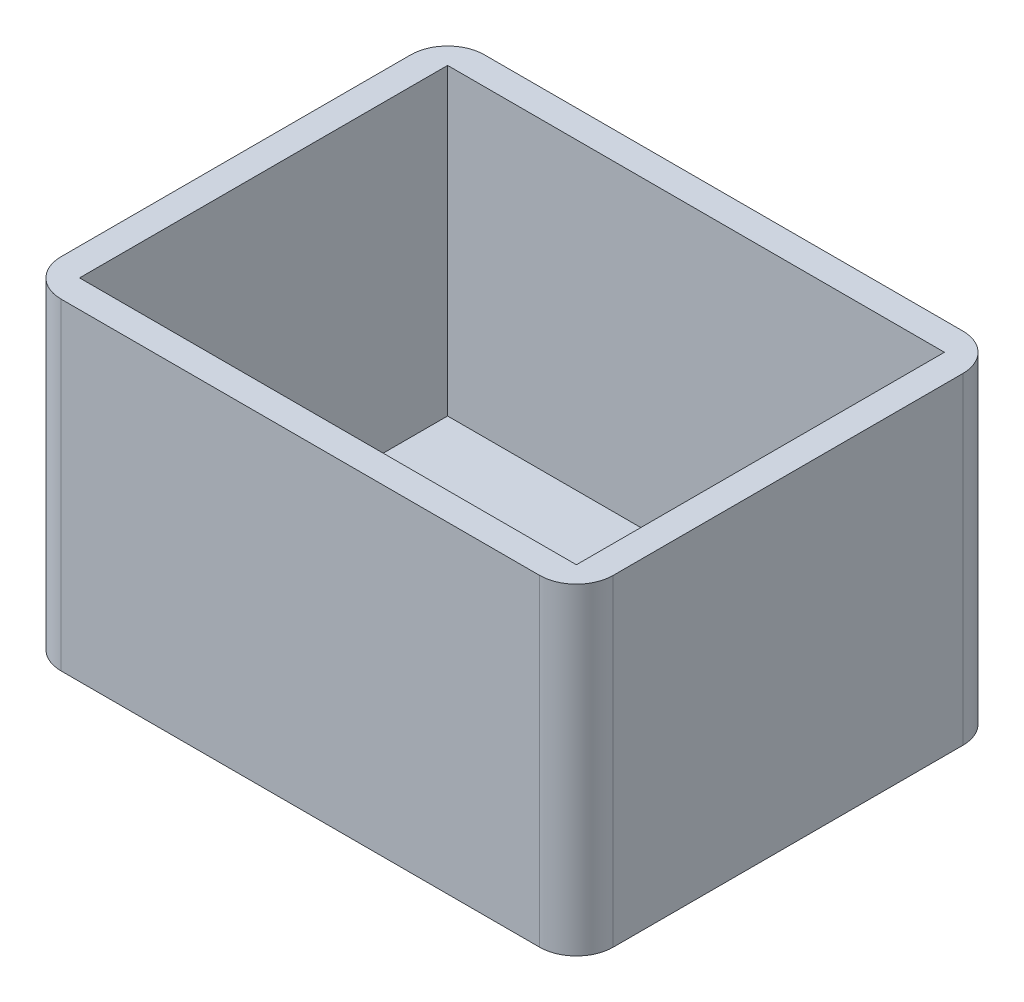
ISO-10303-21;
HEADER;
FILE_DESCRIPTION(('STEP AP214'),'2;1');
FILE_NAME('part.step','',(''),(''),'','','');
FILE_SCHEMA(('AUTOMOTIVE_DESIGN { 1 0 10303 214 1 1 1 1 }'));
ENDSEC;
DATA;
#1=APPLICATION_CONTEXT('core data for automotive mechanical design processes');
#2=APPLICATION_PROTOCOL_DEFINITION('international standard','automotive_design',2000,#1);
#3=PRODUCT_CONTEXT('',#1,'mechanical');
#4=PRODUCT('Part','Part','',(#3));
#5=PRODUCT_RELATED_PRODUCT_CATEGORY('part','',(#4));
#6=PRODUCT_DEFINITION_FORMATION('','',#4);
#7=PRODUCT_DEFINITION_CONTEXT('part definition',#1,'design');
#8=PRODUCT_DEFINITION('design','',#6,#7);
#9=PRODUCT_DEFINITION_SHAPE('','',#8);
#10=(LENGTH_UNIT() NAMED_UNIT(*) SI_UNIT(.MILLI.,.METRE.));
#11=(NAMED_UNIT(*) PLANE_ANGLE_UNIT() SI_UNIT($,.RADIAN.));
#12=(NAMED_UNIT(*) SI_UNIT($,.STERADIAN.) SOLID_ANGLE_UNIT());
#13=UNCERTAINTY_MEASURE_WITH_UNIT(LENGTH_MEASURE(1.E-05),#10,'distance_accuracy_value','');
#14=(GEOMETRIC_REPRESENTATION_CONTEXT(3) GLOBAL_UNCERTAINTY_ASSIGNED_CONTEXT((#13)) GLOBAL_UNIT_ASSIGNED_CONTEXT((#10,
#11,#12)) REPRESENTATION_CONTEXT('',''));
#15=CARTESIAN_POINT('',(0.,0.,0.));
#16=DIRECTION('',(0.,0.,1.));
#17=DIRECTION('',(1.,0.,0.));
#18=AXIS2_PLACEMENT_3D('',#15,#16,#17);
#19=CARTESIAN_POINT('',(0.,0.,0.));
#20=DIRECTION('',(0.,1.,0.));
#21=DIRECTION('',(0.,0.,1.));
#22=AXIS2_PLACEMENT_3D('',#19,#20,#21);
#23=PLANE('',#22);
#24=DIRECTION('',(0.,0.,1.));
#25=VECTOR('',#24,1.);
#26=CARTESIAN_POINT('',(35.,0.,0.));
#27=LINE('',#26,#25);
#28=CARTESIAN_POINT('',(35.,0.,-35.));
#29=VERTEX_POINT('',#28);
#30=CARTESIAN_POINT('',(35.,0.,-33.));
#31=VERTEX_POINT('',#30);
#32=EDGE_CURVE('E235',#29,#31,#27,.T.);
#33=ORIENTED_EDGE('',*,*,#32,.F.);
#34=DIRECTION('',(1.,0.,0.));
#35=VECTOR('',#34,1.);
#36=CARTESIAN_POINT('',(0.,0.,-35.));
#37=LINE('',#36,#35);
#38=CARTESIAN_POINT('',(24.9999999999999,0.,-35.));
#39=VERTEX_POINT('',#38);
#40=EDGE_CURVE('E244',#39,#29,#37,.T.);
#41=ORIENTED_EDGE('',*,*,#40,.F.);
#42=DIRECTION('',(0.,0.,-1.));
#43=VECTOR('',#42,1.);
#44=CARTESIAN_POINT('',(24.9999999999999,0.,0.));
#45=LINE('',#44,#43);
#46=CARTESIAN_POINT('',(24.9999999999999,0.,-33.));
#47=VERTEX_POINT('',#46);
#48=EDGE_CURVE('E247',#47,#39,#45,.T.);
#49=ORIENTED_EDGE('',*,*,#48,.F.);
#50=DIRECTION('',(-1.,0.,0.));
#51=VECTOR('',#50,1.);
#52=CARTESIAN_POINT('',(0.,0.,-33.));
#53=LINE('',#52,#51);
#54=EDGE_CURVE('E192',#31,#47,#53,.T.);
#55=ORIENTED_EDGE('',*,*,#54,.F.);
#56=EDGE_LOOP('',(#33,#41,#49,#55));
#57=FACE_BOUND('',#56,.T.);
#58=DIRECTION('',(0.,0.,-1.));
#59=VECTOR('',#58,1.);
#60=CARTESIAN_POINT('',(60.,0.,0.));
#61=LINE('',#60,#59);
#62=CARTESIAN_POINT('',(60.,0.,-4.));
#63=VERTEX_POINT('',#62);
#64=CARTESIAN_POINT('',(60.,0.,-42.));
#65=VERTEX_POINT('',#64);
#66=EDGE_CURVE('E258',#63,#65,#61,.T.);
#67=ORIENTED_EDGE('',*,*,#66,.F.);
#68=CARTESIAN_POINT('',(56.,0.,-4.));
#69=DIRECTION('',(0.,1.,0.));
#70=DIRECTION('',(0.,0.,1.));
#71=AXIS2_PLACEMENT_3D('',#68,#69,#70);
#72=CIRCLE('',#71,4.);
#73=CARTESIAN_POINT('',(56.,0.,0.));
#74=VERTEX_POINT('',#73);
#75=EDGE_CURVE('E320',#63,#74,#72,.F.);
#76=ORIENTED_EDGE('',*,*,#75,.T.);
#77=DIRECTION('',(1.,0.,0.));
#78=VECTOR('',#77,1.);
#79=CARTESIAN_POINT('',(0.,0.,0.));
#80=LINE('',#79,#78);
#81=CARTESIAN_POINT('',(3.99999999999999,0.,0.));
#82=VERTEX_POINT('',#81);
#83=EDGE_CURVE('E283',#82,#74,#80,.T.);
#84=ORIENTED_EDGE('',*,*,#83,.F.);
#85=CARTESIAN_POINT('',(3.99999999999999,0.,-4.));
#86=DIRECTION('',(0.,1.,0.));
#87=DIRECTION('',(0.,0.,1.));
#88=AXIS2_PLACEMENT_3D('',#85,#86,#87);
#89=CIRCLE('',#88,4.);
#90=CARTESIAN_POINT('',(0.,0.,-3.99999999999999));
#91=VERTEX_POINT('',#90);
#92=EDGE_CURVE('E314',#82,#91,#89,.F.);
#93=ORIENTED_EDGE('',*,*,#92,.T.);
#94=DIRECTION('',(0.,0.,1.));
#95=VECTOR('',#94,1.);
#96=CARTESIAN_POINT('',(0.,0.,0.));
#97=LINE('',#96,#95);
#98=CARTESIAN_POINT('',(0.,0.,-42.));
#99=VERTEX_POINT('',#98);
#100=EDGE_CURVE('E280',#99,#91,#97,.T.);
#101=ORIENTED_EDGE('',*,*,#100,.F.);
#102=CARTESIAN_POINT('',(3.99999999999995,0.,-42.));
#103=DIRECTION('',(0.,1.,0.));
#104=DIRECTION('',(0.,0.,1.));
#105=AXIS2_PLACEMENT_3D('',#102,#103,#104);
#106=CIRCLE('',#105,4.);
#107=CARTESIAN_POINT('',(3.99999999999995,0.,-46.));
#108=VERTEX_POINT('',#107);
#109=EDGE_CURVE('E316',#99,#108,#106,.F.);
#110=ORIENTED_EDGE('',*,*,#109,.T.);
#111=DIRECTION('',(-1.,0.,0.));
#112=VECTOR('',#111,1.);
#113=CARTESIAN_POINT('',(0.,0.,-46.));
#114=LINE('',#113,#112);
#115=CARTESIAN_POINT('',(56.,0.,-46.));
#116=VERTEX_POINT('',#115);
#117=EDGE_CURVE('E250',#116,#108,#114,.T.);
#118=ORIENTED_EDGE('',*,*,#117,.F.);
#119=CARTESIAN_POINT('',(56.,0.,-42.));
#120=DIRECTION('',(0.,1.,0.));
#121=DIRECTION('',(0.,0.,1.));
#122=AXIS2_PLACEMENT_3D('',#119,#120,#121);
#123=CIRCLE('',#122,4.);
#124=EDGE_CURVE('E318',#116,#65,#123,.F.);
#125=ORIENTED_EDGE('',*,*,#124,.T.);
#126=EDGE_LOOP('',(#67,#76,#84,#93,#101,#110,#118,#125));
#127=FACE_BOUND('',#126,.T.);
#128=DIRECTION('',(0.,0.,-1.));
#129=VECTOR('',#128,1.);
#130=CARTESIAN_POINT('',(24.9999999999999,0.,0.));
#131=LINE('',#130,#129);
#132=CARTESIAN_POINT('',(24.9999999999999,0.,-11.));
#133=VERTEX_POINT('',#132);
#134=CARTESIAN_POINT('',(24.9999999999999,0.,-13.));
#135=VERTEX_POINT('',#134);
#136=EDGE_CURVE('E225',#133,#135,#131,.T.);
#137=ORIENTED_EDGE('',*,*,#136,.F.);
#138=DIRECTION('',(-1.,0.,0.));
#139=VECTOR('',#138,1.);
#140=CARTESIAN_POINT('',(0.,0.,-11.));
#141=LINE('',#140,#139);
#142=CARTESIAN_POINT('',(35.,0.,-11.));
#143=VERTEX_POINT('',#142);
#144=EDGE_CURVE('E227',#143,#133,#141,.T.);
#145=ORIENTED_EDGE('',*,*,#144,.F.);
#146=DIRECTION('',(0.,0.,1.));
#147=VECTOR('',#146,1.);
#148=CARTESIAN_POINT('',(35.,0.,0.));
#149=LINE('',#148,#147);
#150=CARTESIAN_POINT('',(35.,0.,-13.));
#151=VERTEX_POINT('',#150);
#152=EDGE_CURVE('E230',#151,#143,#149,.T.);
#153=ORIENTED_EDGE('',*,*,#152,.F.);
#154=DIRECTION('',(-1.,0.,0.));
#155=VECTOR('',#154,1.);
#156=CARTESIAN_POINT('',(0.,0.,-13.));
#157=LINE('',#156,#155);
#158=EDGE_CURVE('E224',#151,#135,#157,.T.);
#159=ORIENTED_EDGE('',*,*,#158,.T.);
#160=EDGE_LOOP('',(#137,#145,#153,#159));
#161=FACE_BOUND('',#160,.T.);
#162=ADVANCED_FACE('F35',(#57,#127,#161),#23,.F.);
#163=CARTESIAN_POINT('',(0.,2.,0.));
#164=DIRECTION('',(0.,1.,0.));
#165=DIRECTION('',(0.,0.,1.));
#166=AXIS2_PLACEMENT_3D('',#163,#164,#165);
#167=PLANE('',#166);
#168=DIRECTION('',(0.,0.,1.));
#169=VECTOR('',#168,1.);
#170=CARTESIAN_POINT('',(2.99999999999999,2.,0.));
#171=LINE('',#170,#169);
#172=CARTESIAN_POINT('',(2.99999999999995,2.,-43.));
#173=VERTEX_POINT('',#172);
#174=CARTESIAN_POINT('',(2.99999999999999,2.,-3.));
#175=VERTEX_POINT('',#174);
#176=EDGE_CURVE('E298',#173,#175,#171,.T.);
#177=ORIENTED_EDGE('',*,*,#176,.T.);
#178=DIRECTION('',(1.,0.,0.));
#179=VECTOR('',#178,1.);
#180=CARTESIAN_POINT('',(0.,2.,-3.));
#181=LINE('',#180,#179);
#182=CARTESIAN_POINT('',(57.,2.,-3.));
#183=VERTEX_POINT('',#182);
#184=EDGE_CURVE('E301',#175,#183,#181,.T.);
#185=ORIENTED_EDGE('',*,*,#184,.T.);
#186=DIRECTION('',(0.,0.,1.));
#187=VECTOR('',#186,1.);
#188=CARTESIAN_POINT('',(57.,2.,0.));
#189=LINE('',#188,#187);
#190=CARTESIAN_POINT('',(57.,2.,-43.));
#191=VERTEX_POINT('',#190);
#192=EDGE_CURVE('E304',#191,#183,#189,.T.);
#193=ORIENTED_EDGE('',*,*,#192,.F.);
#194=DIRECTION('',(1.,0.,0.));
#195=VECTOR('',#194,1.);
#196=CARTESIAN_POINT('',(0.,2.,-43.));
#197=LINE('',#196,#195);
#198=EDGE_CURVE('E307',#173,#191,#197,.T.);
#199=ORIENTED_EDGE('',*,*,#198,.F.);
#200=EDGE_LOOP('',(#177,#185,#193,#199));
#201=FACE_BOUND('',#200,.T.);
#202=ADVANCED_FACE('F390',(#201),#167,.T.);
#203=CARTESIAN_POINT('',(0.,35.,-46.));
#204=DIRECTION('',(0.,0.,1.));
#205=DIRECTION('',(1.,0.,0.));
#206=AXIS2_PLACEMENT_3D('',#203,#204,#205);
#207=PLANE('',#206);
#208=DIRECTION('',(-1.,0.,0.));
#209=VECTOR('',#208,1.);
#210=CARTESIAN_POINT('',(0.,35.,-46.));
#211=LINE('',#210,#209);
#212=CARTESIAN_POINT('',(56.,35.,-46.));
#213=VERTEX_POINT('',#212);
#214=CARTESIAN_POINT('',(3.99999999999995,35.,-46.));
#215=VERTEX_POINT('',#214);
#216=EDGE_CURVE('E265',#213,#215,#211,.T.);
#217=ORIENTED_EDGE('',*,*,#216,.F.);
#218=DIRECTION('',(0.,-1.,0.));
#219=VECTOR('',#218,1.);
#220=CARTESIAN_POINT('',(56.,35.,-46.));
#221=LINE('',#220,#219);
#222=EDGE_CURVE('E337',#213,#116,#221,.T.);
#223=ORIENTED_EDGE('',*,*,#222,.T.);
#224=ORIENTED_EDGE('',*,*,#117,.T.);
#225=DIRECTION('',(0.,-1.,0.));
#226=VECTOR('',#225,1.);
#227=CARTESIAN_POINT('',(3.99999999999995,35.,-46.));
#228=LINE('',#227,#226);
#229=EDGE_CURVE('E335',#108,#215,#228,.F.);
#230=ORIENTED_EDGE('',*,*,#229,.T.);
#231=EDGE_LOOP('',(#217,#223,#224,#230));
#232=FACE_BOUND('',#231,.T.);
#233=ADVANCED_FACE('F396',(#232),#207,.F.);
#234=CARTESIAN_POINT('',(0.,35.,0.));
#235=DIRECTION('',(1.,0.,0.));
#236=DIRECTION('',(0.,0.,-1.));
#237=AXIS2_PLACEMENT_3D('',#234,#235,#236);
#238=PLANE('',#237);
#239=DIRECTION('',(0.,0.,1.));
#240=VECTOR('',#239,1.);
#241=CARTESIAN_POINT('',(0.,35.,0.));
#242=LINE('',#241,#240);
#243=CARTESIAN_POINT('',(0.,35.,-42.));
#244=VERTEX_POINT('',#243);
#245=CARTESIAN_POINT('',(0.,35.,-3.99999999999999));
#246=VERTEX_POINT('',#245);
#247=EDGE_CURVE('E268',#244,#246,#242,.T.);
#248=ORIENTED_EDGE('',*,*,#247,.F.);
#249=DIRECTION('',(0.,-1.,0.));
#250=VECTOR('',#249,1.);
#251=CARTESIAN_POINT('',(0.,35.,-42.));
#252=LINE('',#251,#250);
#253=EDGE_CURVE('E342',#244,#99,#252,.T.);
#254=ORIENTED_EDGE('',*,*,#253,.T.);
#255=ORIENTED_EDGE('',*,*,#100,.T.);
#256=DIRECTION('',(0.,-1.,0.));
#257=VECTOR('',#256,1.);
#258=CARTESIAN_POINT('',(0.,35.,-3.99999999999999));
#259=LINE('',#258,#257);
#260=EDGE_CURVE('E340',#91,#246,#259,.F.);
#261=ORIENTED_EDGE('',*,*,#260,.T.);
#262=EDGE_LOOP('',(#248,#254,#255,#261));
#263=FACE_BOUND('',#262,.T.);
#264=ADVANCED_FACE('F599',(#263),#238,.F.);
#265=CARTESIAN_POINT('',(0.,35.,0.));
#266=DIRECTION('',(0.,0.,-1.));
#267=DIRECTION('',(-1.,0.,0.));
#268=AXIS2_PLACEMENT_3D('',#265,#266,#267);
#269=PLANE('',#268);
#270=ORIENTED_EDGE('',*,*,#83,.T.);
#271=DIRECTION('',(0.,-1.,0.));
#272=VECTOR('',#271,1.);
#273=CARTESIAN_POINT('',(56.,35.,0.));
#274=LINE('',#273,#272);
#275=CARTESIAN_POINT('',(56.,35.,0.));
#276=VERTEX_POINT('',#275);
#277=EDGE_CURVE('E325',#74,#276,#274,.F.);
#278=ORIENTED_EDGE('',*,*,#277,.T.);
#279=DIRECTION('',(1.,0.,0.));
#280=VECTOR('',#279,1.);
#281=CARTESIAN_POINT('',(0.,35.,0.));
#282=LINE('',#281,#280);
#283=CARTESIAN_POINT('',(3.99999999999999,35.,0.));
#284=VERTEX_POINT('',#283);
#285=EDGE_CURVE('E271',#284,#276,#282,.T.);
#286=ORIENTED_EDGE('',*,*,#285,.F.);
#287=DIRECTION('',(0.,-1.,0.));
#288=VECTOR('',#287,1.);
#289=CARTESIAN_POINT('',(3.99999999999999,35.,0.));
#290=LINE('',#289,#288);
#291=EDGE_CURVE('E322',#284,#82,#290,.T.);
#292=ORIENTED_EDGE('',*,*,#291,.T.);
#293=EDGE_LOOP('',(#270,#278,#286,#292));
#294=FACE_BOUND('',#293,.T.);
#295=ADVANCED_FACE('F593',(#294),#269,.F.);
#296=CARTESIAN_POINT('',(2.99999999999999,35.,0.));
#297=DIRECTION('',(1.,0.,0.));
#298=DIRECTION('',(0.,0.,-1.));
#299=AXIS2_PLACEMENT_3D('',#296,#297,#298);
#300=PLANE('',#299);
#301=DIRECTION('',(0.,-1.,0.));
#302=VECTOR('',#301,1.);
#303=CARTESIAN_POINT('',(2.99999999999999,35.,-3.));
#304=LINE('',#303,#302);
#305=CARTESIAN_POINT('',(2.99999999999999,35.,-3.));
#306=VERTEX_POINT('',#305);
#307=EDGE_CURVE('E277',#306,#175,#304,.T.);
#308=ORIENTED_EDGE('',*,*,#307,.T.);
#309=ORIENTED_EDGE('',*,*,#176,.F.);
#310=DIRECTION('',(0.,-1.,0.));
#311=VECTOR('',#310,1.);
#312=CARTESIAN_POINT('',(2.99999999999995,35.,-43.));
#313=LINE('',#312,#311);
#314=CARTESIAN_POINT('',(2.99999999999995,35.,-43.));
#315=VERTEX_POINT('',#314);
#316=EDGE_CURVE('E295',#315,#173,#313,.T.);
#317=ORIENTED_EDGE('',*,*,#316,.F.);
#318=DIRECTION('',(0.,0.,1.));
#319=VECTOR('',#318,1.);
#320=CARTESIAN_POINT('',(2.99999999999999,35.,0.));
#321=LINE('',#320,#319);
#322=EDGE_CURVE('E254',#315,#306,#321,.T.);
#323=ORIENTED_EDGE('',*,*,#322,.T.);
#324=EDGE_LOOP('',(#308,#309,#317,#323));
#325=FACE_BOUND('',#324,.T.);
#326=ADVANCED_FACE('F598',(#325),#300,.T.);
#327=CARTESIAN_POINT('',(0.,35.,-43.));
#328=DIRECTION('',(0.,0.,-1.));
#329=DIRECTION('',(-1.,0.,0.));
#330=AXIS2_PLACEMENT_3D('',#327,#328,#329);
#331=PLANE('',#330);
#332=ORIENTED_EDGE('',*,*,#198,.T.);
#333=DIRECTION('',(0.,-1.,0.));
#334=VECTOR('',#333,1.);
#335=CARTESIAN_POINT('',(57.,35.,-43.));
#336=LINE('',#335,#334);
#337=CARTESIAN_POINT('',(57.,35.,-43.));
#338=VERTEX_POINT('',#337);
#339=EDGE_CURVE('E292',#338,#191,#336,.T.);
#340=ORIENTED_EDGE('',*,*,#339,.F.);
#341=DIRECTION('',(1.,0.,0.));
#342=VECTOR('',#341,1.);
#343=CARTESIAN_POINT('',(0.,35.,-43.));
#344=LINE('',#343,#342);
#345=EDGE_CURVE('E257',#315,#338,#344,.T.);
#346=ORIENTED_EDGE('',*,*,#345,.F.);
#347=ORIENTED_EDGE('',*,*,#316,.T.);
#348=EDGE_LOOP('',(#332,#340,#346,#347));
#349=FACE_BOUND('',#348,.T.);
#350=ADVANCED_FACE('F638',(#349),#331,.F.);
#351=CARTESIAN_POINT('',(57.,35.,0.));
#352=DIRECTION('',(1.,0.,0.));
#353=DIRECTION('',(0.,0.,-1.));
#354=AXIS2_PLACEMENT_3D('',#351,#352,#353);
#355=PLANE('',#354);
#356=ORIENTED_EDGE('',*,*,#192,.T.);
#357=DIRECTION('',(0.,-1.,0.));
#358=VECTOR('',#357,1.);
#359=CARTESIAN_POINT('',(57.,35.,-3.));
#360=LINE('',#359,#358);
#361=CARTESIAN_POINT('',(57.,35.,-3.));
#362=VERTEX_POINT('',#361);
#363=EDGE_CURVE('E290',#362,#183,#360,.T.);
#364=ORIENTED_EDGE('',*,*,#363,.F.);
#365=DIRECTION('',(0.,0.,1.));
#366=VECTOR('',#365,1.);
#367=CARTESIAN_POINT('',(57.,35.,0.));
#368=LINE('',#367,#366);
#369=EDGE_CURVE('E260',#338,#362,#368,.T.);
#370=ORIENTED_EDGE('',*,*,#369,.F.);
#371=ORIENTED_EDGE('',*,*,#339,.T.);
#372=EDGE_LOOP('',(#356,#364,#370,#371));
#373=FACE_BOUND('',#372,.T.);
#374=ADVANCED_FACE('F628',(#373),#355,.F.);
#375=CARTESIAN_POINT('',(0.,35.,-3.));
#376=DIRECTION('',(0.,0.,-1.));
#377=DIRECTION('',(-1.,0.,0.));
#378=AXIS2_PLACEMENT_3D('',#375,#376,#377);
#379=PLANE('',#378);
#380=ORIENTED_EDGE('',*,*,#363,.T.);
#381=ORIENTED_EDGE('',*,*,#184,.F.);
#382=ORIENTED_EDGE('',*,*,#307,.F.);
#383=DIRECTION('',(1.,0.,0.));
#384=VECTOR('',#383,1.);
#385=CARTESIAN_POINT('',(0.,35.,-3.));
#386=LINE('',#385,#384);
#387=EDGE_CURVE('E262',#306,#362,#386,.T.);
#388=ORIENTED_EDGE('',*,*,#387,.T.);
#389=EDGE_LOOP('',(#380,#381,#382,#388));
#390=FACE_BOUND('',#389,.T.);
#391=ADVANCED_FACE('F584',(#390),#379,.T.);
#392=CARTESIAN_POINT('',(60.,35.,0.));
#393=DIRECTION('',(-1.,0.,0.));
#394=DIRECTION('',(0.,0.,1.));
#395=AXIS2_PLACEMENT_3D('',#392,#393,#394);
#396=PLANE('',#395);
#397=DIRECTION('',(0.,0.,-1.));
#398=VECTOR('',#397,1.);
#399=CARTESIAN_POINT('',(60.,35.,0.));
#400=LINE('',#399,#398);
#401=CARTESIAN_POINT('',(60.,35.,-4.));
#402=VERTEX_POINT('',#401);
#403=CARTESIAN_POINT('',(60.,35.,-42.));
#404=VERTEX_POINT('',#403);
#405=EDGE_CURVE('E274',#402,#404,#400,.T.);
#406=ORIENTED_EDGE('',*,*,#405,.F.);
#407=DIRECTION('',(0.,-1.,0.));
#408=VECTOR('',#407,1.);
#409=CARTESIAN_POINT('',(60.,35.,-4.));
#410=LINE('',#409,#408);
#411=EDGE_CURVE('E311',#402,#63,#410,.T.);
#412=ORIENTED_EDGE('',*,*,#411,.T.);
#413=ORIENTED_EDGE('',*,*,#66,.T.);
#414=DIRECTION('',(0.,-1.,0.));
#415=VECTOR('',#414,1.);
#416=CARTESIAN_POINT('',(60.,35.,-42.));
#417=LINE('',#416,#415);
#418=EDGE_CURVE('E309',#65,#404,#417,.F.);
#419=ORIENTED_EDGE('',*,*,#418,.T.);
#420=EDGE_LOOP('',(#406,#412,#413,#419));
#421=FACE_BOUND('',#420,.T.);
#422=ADVANCED_FACE('F573',(#421),#396,.F.);
#423=CARTESIAN_POINT('',(0.,35.,0.));
#424=DIRECTION('',(0.,1.,0.));
#425=DIRECTION('',(0.,0.,1.));
#426=AXIS2_PLACEMENT_3D('',#423,#424,#425);
#427=PLANE('',#426);
#428=ORIENTED_EDGE('',*,*,#322,.F.);
#429=ORIENTED_EDGE('',*,*,#345,.T.);
#430=ORIENTED_EDGE('',*,*,#369,.T.);
#431=ORIENTED_EDGE('',*,*,#387,.F.);
#432=EDGE_LOOP('',(#428,#429,#430,#431));
#433=FACE_BOUND('',#432,.T.);
#434=ORIENTED_EDGE('',*,*,#285,.T.);
#435=CARTESIAN_POINT('',(56.,35.,-4.));
#436=DIRECTION('',(0.,1.,0.));
#437=DIRECTION('',(0.,0.,1.));
#438=AXIS2_PLACEMENT_3D('',#435,#436,#437);
#439=CIRCLE('',#438,4.);
#440=EDGE_CURVE('E333',#276,#402,#439,.T.);
#441=ORIENTED_EDGE('',*,*,#440,.T.);
#442=ORIENTED_EDGE('',*,*,#405,.T.);
#443=CARTESIAN_POINT('',(56.,35.,-42.));
#444=DIRECTION('',(0.,1.,0.));
#445=DIRECTION('',(0.,0.,1.));
#446=AXIS2_PLACEMENT_3D('',#443,#444,#445);
#447=CIRCLE('',#446,4.);
#448=EDGE_CURVE('E331',#404,#213,#447,.T.);
#449=ORIENTED_EDGE('',*,*,#448,.T.);
#450=ORIENTED_EDGE('',*,*,#216,.T.);
#451=CARTESIAN_POINT('',(3.99999999999995,35.,-42.));
#452=DIRECTION('',(0.,1.,0.));
#453=DIRECTION('',(0.,0.,1.));
#454=AXIS2_PLACEMENT_3D('',#451,#452,#453);
#455=CIRCLE('',#454,4.);
#456=EDGE_CURVE('E329',#215,#244,#455,.T.);
#457=ORIENTED_EDGE('',*,*,#456,.T.);
#458=ORIENTED_EDGE('',*,*,#247,.T.);
#459=CARTESIAN_POINT('',(3.99999999999999,35.,-4.));
#460=DIRECTION('',(0.,1.,0.));
#461=DIRECTION('',(0.,0.,1.));
#462=AXIS2_PLACEMENT_3D('',#459,#460,#461);
#463=CIRCLE('',#462,4.);
#464=EDGE_CURVE('E327',#246,#284,#463,.T.);
#465=ORIENTED_EDGE('',*,*,#464,.T.);
#466=EDGE_LOOP('',(#434,#441,#442,#449,#450,#457,#458,#465));
#467=FACE_BOUND('',#466,.T.);
#468=ADVANCED_FACE('F406',(#433,#467),#427,.T.);
#469=CARTESIAN_POINT('',(56.,35.,-4.));
#470=DIRECTION('',(0.,-1.,0.));
#471=DIRECTION('',(0.,0.,-1.));
#472=AXIS2_PLACEMENT_3D('',#469,#470,#471);
#473=CYLINDRICAL_SURFACE('',#472,4.);
#474=ORIENTED_EDGE('',*,*,#440,.F.);
#475=ORIENTED_EDGE('',*,*,#277,.F.);
#476=ORIENTED_EDGE('',*,*,#75,.F.);
#477=ORIENTED_EDGE('',*,*,#411,.F.);
#478=EDGE_LOOP('',(#474,#475,#476,#477));
#479=FACE_BOUND('',#478,.T.);
#480=ADVANCED_FACE('F402',(#479),#473,.T.);
#481=CARTESIAN_POINT('',(56.,35.,-42.));
#482=DIRECTION('',(0.,-1.,0.));
#483=DIRECTION('',(0.,0.,-1.));
#484=AXIS2_PLACEMENT_3D('',#481,#482,#483);
#485=CYLINDRICAL_SURFACE('',#484,4.);
#486=ORIENTED_EDGE('',*,*,#448,.F.);
#487=ORIENTED_EDGE('',*,*,#418,.F.);
#488=ORIENTED_EDGE('',*,*,#124,.F.);
#489=ORIENTED_EDGE('',*,*,#222,.F.);
#490=EDGE_LOOP('',(#486,#487,#488,#489));
#491=FACE_BOUND('',#490,.T.);
#492=ADVANCED_FACE('F405',(#491),#485,.T.);
#493=CARTESIAN_POINT('',(3.99999999999995,35.,-42.));
#494=DIRECTION('',(0.,-1.,0.));
#495=DIRECTION('',(0.,0.,-1.));
#496=AXIS2_PLACEMENT_3D('',#493,#494,#495);
#497=CYLINDRICAL_SURFACE('',#496,4.);
#498=ORIENTED_EDGE('',*,*,#456,.F.);
#499=ORIENTED_EDGE('',*,*,#229,.F.);
#500=ORIENTED_EDGE('',*,*,#109,.F.);
#501=ORIENTED_EDGE('',*,*,#253,.F.);
#502=EDGE_LOOP('',(#498,#499,#500,#501));
#503=FACE_BOUND('',#502,.T.);
#504=ADVANCED_FACE('F410',(#503),#497,.T.);
#505=CARTESIAN_POINT('',(3.99999999999999,35.,-4.));
#506=DIRECTION('',(0.,-1.,0.));
#507=DIRECTION('',(0.,0.,-1.));
#508=AXIS2_PLACEMENT_3D('',#505,#506,#507);
#509=CYLINDRICAL_SURFACE('',#508,4.);
#510=ORIENTED_EDGE('',*,*,#464,.F.);
#511=ORIENTED_EDGE('',*,*,#260,.F.);
#512=ORIENTED_EDGE('',*,*,#92,.F.);
#513=ORIENTED_EDGE('',*,*,#291,.F.);
#514=EDGE_LOOP('',(#510,#511,#512,#513));
#515=FACE_BOUND('',#514,.T.);
#516=ADVANCED_FACE('F414',(#515),#509,.T.);
#517=CARTESIAN_POINT('',(35.,-2.,0.));
#518=DIRECTION('',(-1.,0.,0.));
#519=DIRECTION('',(0.,0.,1.));
#520=AXIS2_PLACEMENT_3D('',#517,#518,#519);
#521=PLANE('',#520);
#522=DIRECTION('',(0.,0.,-1.));
#523=VECTOR('',#522,1.);
#524=CARTESIAN_POINT('',(35.,-4.,-35.));
#525=LINE('',#524,#523);
#526=CARTESIAN_POINT('',(35.,-4.,-13.));
#527=VERTEX_POINT('',#526);
#528=CARTESIAN_POINT('',(35.,-4.,-33.));
#529=VERTEX_POINT('',#528);
#530=EDGE_CURVE('E218',#527,#529,#525,.T.);
#531=ORIENTED_EDGE('',*,*,#530,.T.);
#532=CARTESIAN_POINT('',(35.,-2.,-33.));
#533=DIRECTION('',(-1.,0.,0.));
#534=DIRECTION('',(0.,0.,1.));
#535=AXIS2_PLACEMENT_3D('',#532,#533,#534);
#536=CIRCLE('',#535,2.);
#537=CARTESIAN_POINT('',(35.,-2.,-35.));
#538=VERTEX_POINT('',#537);
#539=EDGE_CURVE('E43',#529,#538,#536,.F.);
#540=ORIENTED_EDGE('',*,*,#539,.T.);
#541=DIRECTION('',(0.,1.,0.));
#542=VECTOR('',#541,1.);
#543=CARTESIAN_POINT('',(35.,-2.,-35.));
#544=LINE('',#543,#542);
#545=EDGE_CURVE('E206',#538,#29,#544,.T.);
#546=ORIENTED_EDGE('',*,*,#545,.T.);
#547=ORIENTED_EDGE('',*,*,#32,.T.);
#548=DIRECTION('',(0.,1.,0.));
#549=VECTOR('',#548,1.);
#550=CARTESIAN_POINT('',(35.,-2.,-33.));
#551=LINE('',#550,#549);
#552=CARTESIAN_POINT('',(35.,-2.,-33.));
#553=VERTEX_POINT('',#552);
#554=EDGE_CURVE('E196',#553,#31,#551,.T.);
#555=ORIENTED_EDGE('',*,*,#554,.F.);
#556=DIRECTION('',(0.,0.,-1.));
#557=VECTOR('',#556,1.);
#558=CARTESIAN_POINT('',(35.,-2.,-35.));
#559=LINE('',#558,#557);
#560=CARTESIAN_POINT('',(35.,-2.,-13.));
#561=VERTEX_POINT('',#560);
#562=EDGE_CURVE('E205',#561,#553,#559,.T.);
#563=ORIENTED_EDGE('',*,*,#562,.F.);
#564=DIRECTION('',(0.,1.,0.));
#565=VECTOR('',#564,1.);
#566=CARTESIAN_POINT('',(35.,-2.,-13.));
#567=LINE('',#566,#565);
#568=EDGE_CURVE('E236',#561,#151,#567,.T.);
#569=ORIENTED_EDGE('',*,*,#568,.T.);
#570=ORIENTED_EDGE('',*,*,#152,.T.);
#571=DIRECTION('',(0.,1.,0.));
#572=VECTOR('',#571,1.);
#573=CARTESIAN_POINT('',(35.,-2.,-11.));
#574=LINE('',#573,#572);
#575=CARTESIAN_POINT('',(35.,-2.,-11.));
#576=VERTEX_POINT('',#575);
#577=EDGE_CURVE('E239',#576,#143,#574,.T.);
#578=ORIENTED_EDGE('',*,*,#577,.F.);
#579=CARTESIAN_POINT('',(35.,-2.,-13.));
#580=DIRECTION('',(-1.,0.,0.));
#581=DIRECTION('',(0.,0.,1.));
#582=AXIS2_PLACEMENT_3D('',#579,#580,#581);
#583=CIRCLE('',#582,2.);
#584=EDGE_CURVE('E50',#576,#527,#583,.F.);
#585=ORIENTED_EDGE('',*,*,#584,.T.);
#586=EDGE_LOOP('',(#531,#540,#546,#547,#555,#563,#569,#570,#578,#585));
#587=FACE_BOUND('',#586,.T.);
#588=ADVANCED_FACE('F358',(#587),#521,.F.);
#589=CARTESIAN_POINT('',(0.,-2.,-33.));
#590=DIRECTION('',(0.,0.,-1.));
#591=DIRECTION('',(-1.,0.,0.));
#592=AXIS2_PLACEMENT_3D('',#589,#590,#591);
#593=PLANE('',#592);
#594=ORIENTED_EDGE('',*,*,#54,.T.);
#595=DIRECTION('',(0.,1.,0.));
#596=VECTOR('',#595,1.);
#597=CARTESIAN_POINT('',(24.9999999999999,-2.,-33.));
#598=LINE('',#597,#596);
#599=CARTESIAN_POINT('',(24.9999999999999,-2.,-33.));
#600=VERTEX_POINT('',#599);
#601=EDGE_CURVE('E186',#600,#47,#598,.T.);
#602=ORIENTED_EDGE('',*,*,#601,.F.);
#603=DIRECTION('',(-1.,0.,0.));
#604=VECTOR('',#603,1.);
#605=CARTESIAN_POINT('',(0.,-2.,-33.));
#606=LINE('',#605,#604);
#607=EDGE_CURVE('E190',#553,#600,#606,.T.);
#608=ORIENTED_EDGE('',*,*,#607,.F.);
#609=ORIENTED_EDGE('',*,*,#554,.T.);
#610=EDGE_LOOP('',(#594,#602,#608,#609));
#611=FACE_BOUND('',#610,.T.);
#612=ADVANCED_FACE('F188',(#611),#593,.F.);
#613=CARTESIAN_POINT('',(24.9999999999999,-2.,0.));
#614=DIRECTION('',(1.,0.,0.));
#615=DIRECTION('',(0.,0.,-1.));
#616=AXIS2_PLACEMENT_3D('',#613,#614,#615);
#617=PLANE('',#616);
#618=DIRECTION('',(0.,1.,0.));
#619=VECTOR('',#618,1.);
#620=CARTESIAN_POINT('',(24.9999999999999,-2.,-35.));
#621=LINE('',#620,#619);
#622=CARTESIAN_POINT('',(24.9999999999999,-2.,-35.));
#623=VERTEX_POINT('',#622);
#624=EDGE_CURVE('E197',#623,#39,#621,.T.);
#625=ORIENTED_EDGE('',*,*,#624,.F.);
#626=CARTESIAN_POINT('',(24.9999999999999,-2.,-33.));
#627=DIRECTION('',(1.,0.,0.));
#628=DIRECTION('',(0.,0.,-1.));
#629=AXIS2_PLACEMENT_3D('',#626,#627,#628);
#630=CIRCLE('',#629,2.);
#631=CARTESIAN_POINT('',(24.9999999999999,-4.,-33.));
#632=VERTEX_POINT('',#631);
#633=EDGE_CURVE('E350',#623,#632,#630,.F.);
#634=ORIENTED_EDGE('',*,*,#633,.T.);
#635=DIRECTION('',(0.,0.,1.));
#636=VECTOR('',#635,1.);
#637=CARTESIAN_POINT('',(24.9999999999999,-4.,-35.));
#638=LINE('',#637,#636);
#639=CARTESIAN_POINT('',(25.,-4.,-13.));
#640=VERTEX_POINT('',#639);
#641=EDGE_CURVE('E215',#632,#640,#638,.T.);
#642=ORIENTED_EDGE('',*,*,#641,.T.);
#643=CARTESIAN_POINT('',(24.9999999999999,-2.,-13.));
#644=DIRECTION('',(1.,0.,0.));
#645=DIRECTION('',(0.,0.,-1.));
#646=AXIS2_PLACEMENT_3D('',#643,#644,#645);
#647=CIRCLE('',#646,2.);
#648=CARTESIAN_POINT('',(24.9999999999999,-2.,-11.));
#649=VERTEX_POINT('',#648);
#650=EDGE_CURVE('E348',#640,#649,#647,.F.);
#651=ORIENTED_EDGE('',*,*,#650,.T.);
#652=DIRECTION('',(0.,1.,0.));
#653=VECTOR('',#652,1.);
#654=CARTESIAN_POINT('',(24.9999999999999,-2.,-11.));
#655=LINE('',#654,#653);
#656=EDGE_CURVE('E223',#649,#133,#655,.T.);
#657=ORIENTED_EDGE('',*,*,#656,.T.);
#658=ORIENTED_EDGE('',*,*,#136,.T.);
#659=DIRECTION('',(0.,1.,0.));
#660=VECTOR('',#659,1.);
#661=CARTESIAN_POINT('',(24.9999999999999,-2.,-13.));
#662=LINE('',#661,#660);
#663=CARTESIAN_POINT('',(24.9999999999999,-2.,-13.));
#664=VERTEX_POINT('',#663);
#665=EDGE_CURVE('E212',#664,#135,#662,.T.);
#666=ORIENTED_EDGE('',*,*,#665,.F.);
#667=DIRECTION('',(0.,0.,1.));
#668=VECTOR('',#667,1.);
#669=CARTESIAN_POINT('',(24.9999999999999,-2.,-35.));
#670=LINE('',#669,#668);
#671=EDGE_CURVE('E202',#600,#664,#670,.T.);
#672=ORIENTED_EDGE('',*,*,#671,.F.);
#673=ORIENTED_EDGE('',*,*,#601,.T.);
#674=ORIENTED_EDGE('',*,*,#48,.T.);
#675=EDGE_LOOP('',(#625,#634,#642,#651,#657,#658,#666,#672,#673,#674));
#676=FACE_BOUND('',#675,.T.);
#677=ADVANCED_FACE('F209',(#676),#617,.F.);
#678=CARTESIAN_POINT('',(0.,-2.,-35.));
#679=DIRECTION('',(0.,0.,1.));
#680=DIRECTION('',(1.,0.,0.));
#681=AXIS2_PLACEMENT_3D('',#678,#679,#680);
#682=PLANE('',#681);
#683=ORIENTED_EDGE('',*,*,#545,.F.);
#684=DIRECTION('',(-1.,0.,0.));
#685=VECTOR('',#684,1.);
#686=CARTESIAN_POINT('',(0.,-2.,-35.));
#687=LINE('',#686,#685);
#688=EDGE_CURVE('E345',#538,#623,#687,.T.);
#689=ORIENTED_EDGE('',*,*,#688,.T.);
#690=ORIENTED_EDGE('',*,*,#624,.T.);
#691=ORIENTED_EDGE('',*,*,#40,.T.);
#692=EDGE_LOOP('',(#683,#689,#690,#691));
#693=FACE_BOUND('',#692,.T.);
#694=ADVANCED_FACE('F363',(#693),#682,.F.);
#695=CARTESIAN_POINT('',(0.,-2.,-13.));
#696=DIRECTION('',(0.,0.,-1.));
#697=DIRECTION('',(-1.,0.,0.));
#698=AXIS2_PLACEMENT_3D('',#695,#696,#697);
#699=PLANE('',#698);
#700=ORIENTED_EDGE('',*,*,#158,.F.);
#701=ORIENTED_EDGE('',*,*,#568,.F.);
#702=DIRECTION('',(-1.,0.,0.));
#703=VECTOR('',#702,1.);
#704=CARTESIAN_POINT('',(0.,-2.,-13.));
#705=LINE('',#704,#703);
#706=EDGE_CURVE('E221',#561,#664,#705,.T.);
#707=ORIENTED_EDGE('',*,*,#706,.T.);
#708=ORIENTED_EDGE('',*,*,#665,.T.);
#709=EDGE_LOOP('',(#700,#701,#707,#708));
#710=FACE_BOUND('',#709,.T.);
#711=ADVANCED_FACE('F379',(#710),#699,.T.);
#712=CARTESIAN_POINT('',(0.,-2.,-11.));
#713=DIRECTION('',(0.,0.,-1.));
#714=DIRECTION('',(-1.,0.,0.));
#715=AXIS2_PLACEMENT_3D('',#712,#713,#714);
#716=PLANE('',#715);
#717=ORIENTED_EDGE('',*,*,#656,.F.);
#718=DIRECTION('',(1.,0.,0.));
#719=VECTOR('',#718,1.);
#720=CARTESIAN_POINT('',(0.,-2.,-11.));
#721=LINE('',#720,#719);
#722=EDGE_CURVE('E11',#649,#576,#721,.T.);
#723=ORIENTED_EDGE('',*,*,#722,.T.);
#724=ORIENTED_EDGE('',*,*,#577,.T.);
#725=ORIENTED_EDGE('',*,*,#144,.T.);
#726=EDGE_LOOP('',(#717,#723,#724,#725));
#727=FACE_BOUND('',#726,.T.);
#728=ADVANCED_FACE('F372',(#727),#716,.F.);
#729=CARTESIAN_POINT('',(0.,-2.,0.));
#730=DIRECTION('',(0.,1.,0.));
#731=DIRECTION('',(0.,0.,1.));
#732=AXIS2_PLACEMENT_3D('',#729,#730,#731);
#733=PLANE('',#732);
#734=ORIENTED_EDGE('',*,*,#562,.T.);
#735=ORIENTED_EDGE('',*,*,#607,.T.);
#736=ORIENTED_EDGE('',*,*,#671,.T.);
#737=ORIENTED_EDGE('',*,*,#706,.F.);
#738=EDGE_LOOP('',(#734,#735,#736,#737));
#739=FACE_BOUND('',#738,.T.);
#740=ADVANCED_FACE('F201',(#739),#733,.T.);
#741=CARTESIAN_POINT('',(0.,-4.,0.));
#742=DIRECTION('',(0.,1.,0.));
#743=DIRECTION('',(0.,0.,1.));
#744=AXIS2_PLACEMENT_3D('',#741,#742,#743);
#745=PLANE('',#744);
#746=ORIENTED_EDGE('',*,*,#641,.F.);
#747=DIRECTION('',(-1.,0.,0.));
#748=VECTOR('',#747,1.);
#749=CARTESIAN_POINT('',(0.,-4.,-33.));
#750=LINE('',#749,#748);
#751=EDGE_CURVE('E57',#632,#529,#750,.F.);
#752=ORIENTED_EDGE('',*,*,#751,.T.);
#753=ORIENTED_EDGE('',*,*,#530,.F.);
#754=DIRECTION('',(1.,0.,0.));
#755=VECTOR('',#754,1.);
#756=CARTESIAN_POINT('',(0.,-4.,-13.));
#757=LINE('',#756,#755);
#758=EDGE_CURVE('E352',#527,#640,#757,.F.);
#759=ORIENTED_EDGE('',*,*,#758,.T.);
#760=EDGE_LOOP('',(#746,#752,#753,#759));
#761=FACE_BOUND('',#760,.T.);
#762=ADVANCED_FACE('F368',(#761),#745,.F.);
#763=CARTESIAN_POINT('',(0.,-2.,-33.));
#764=DIRECTION('',(-1.,0.,0.));
#765=DIRECTION('',(0.,0.,1.));
#766=AXIS2_PLACEMENT_3D('',#763,#764,#765);
#767=CYLINDRICAL_SURFACE('',#766,2.);
#768=ORIENTED_EDGE('',*,*,#539,.F.);
#769=ORIENTED_EDGE('',*,*,#751,.F.);
#770=ORIENTED_EDGE('',*,*,#633,.F.);
#771=ORIENTED_EDGE('',*,*,#688,.F.);
#772=EDGE_LOOP('',(#768,#769,#770,#771));
#773=FACE_BOUND('',#772,.T.);
#774=ADVANCED_FACE('F365',(#773),#767,.T.);
#775=CARTESIAN_POINT('',(0.,-2.,-13.));
#776=DIRECTION('',(1.,0.,0.));
#777=DIRECTION('',(0.,0.,-1.));
#778=AXIS2_PLACEMENT_3D('',#775,#776,#777);
#779=CYLINDRICAL_SURFACE('',#778,2.);
#780=ORIENTED_EDGE('',*,*,#650,.F.);
#781=ORIENTED_EDGE('',*,*,#758,.F.);
#782=ORIENTED_EDGE('',*,*,#584,.F.);
#783=ORIENTED_EDGE('',*,*,#722,.F.);
#784=EDGE_LOOP('',(#780,#781,#782,#783));
#785=FACE_BOUND('',#784,.T.);
#786=ADVANCED_FACE('F37',(#785),#779,.T.);
#787=CLOSED_SHELL('',(#162,#202,#233,#264,#295,#326,#350,#374,#391,#422,#468,#480,#492,#504,
#516,#588,#612,#677,#694,#711,#728,#740,#762,#774,#786));
#788=MANIFOLD_SOLID_BREP('B2',#787);
#789=ADVANCED_BREP_SHAPE_REPRESENTATION('',(#18,#788),#14);
#790=SHAPE_DEFINITION_REPRESENTATION(#9,#789);
ENDSEC;
END-ISO-10303-21;
